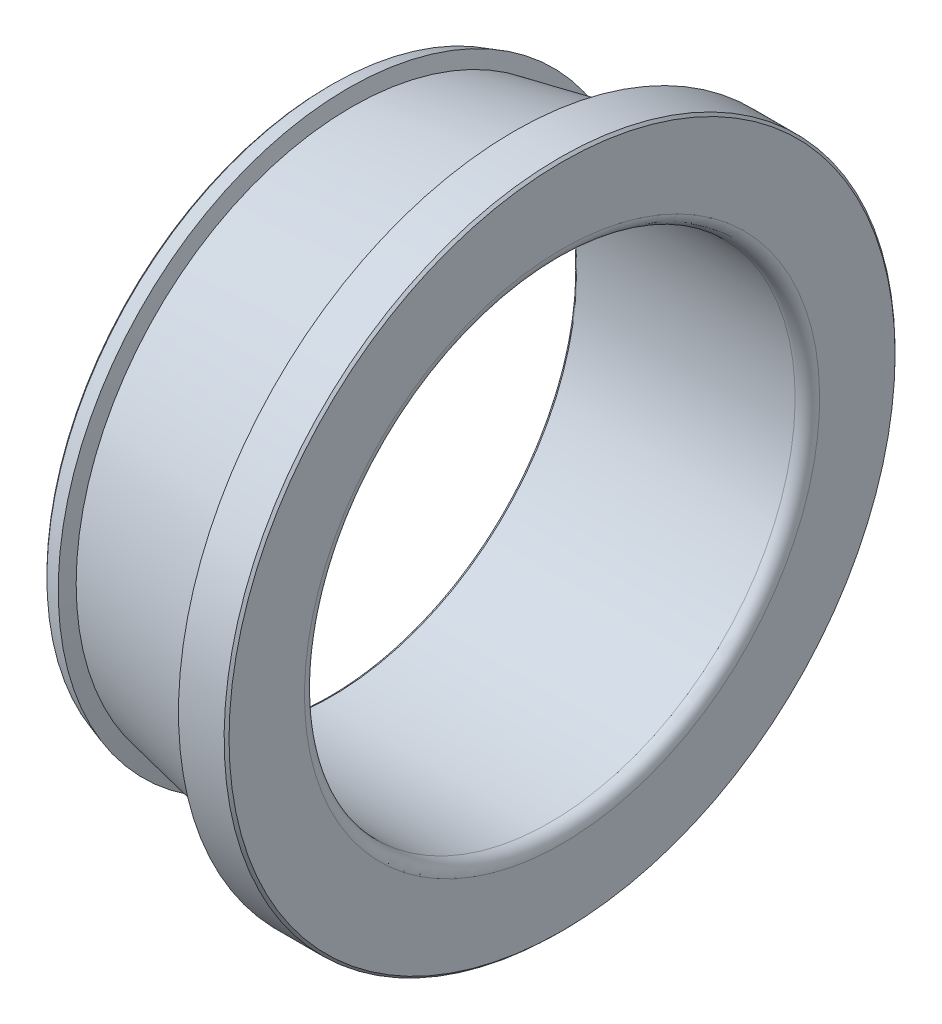
ISO-10303-21;
HEADER;
FILE_DESCRIPTION(('STEP AP214'),'2;1');
FILE_NAME('part.step','',(''),(''),'','','');
FILE_SCHEMA(('AUTOMOTIVE_DESIGN { 1 0 10303 214 1 1 1 1 }'));
ENDSEC;
DATA;
#1=APPLICATION_CONTEXT('core data for automotive mechanical design processes');
#2=APPLICATION_PROTOCOL_DEFINITION('international standard','automotive_design',2000,#1);
#3=PRODUCT_CONTEXT('',#1,'mechanical');
#4=PRODUCT('Part','Part','',(#3));
#5=PRODUCT_RELATED_PRODUCT_CATEGORY('part','',(#4));
#6=PRODUCT_DEFINITION_FORMATION('','',#4);
#7=PRODUCT_DEFINITION_CONTEXT('part definition',#1,'design');
#8=PRODUCT_DEFINITION('design','',#6,#7);
#9=PRODUCT_DEFINITION_SHAPE('','',#8);
#10=(LENGTH_UNIT() NAMED_UNIT(*) SI_UNIT(.MILLI.,.METRE.));
#11=(NAMED_UNIT(*) PLANE_ANGLE_UNIT() SI_UNIT($,.RADIAN.));
#12=(NAMED_UNIT(*) SI_UNIT($,.STERADIAN.) SOLID_ANGLE_UNIT());
#13=UNCERTAINTY_MEASURE_WITH_UNIT(LENGTH_MEASURE(1.E-05),#10,'distance_accuracy_value','');
#14=(GEOMETRIC_REPRESENTATION_CONTEXT(3) GLOBAL_UNCERTAINTY_ASSIGNED_CONTEXT((#13)) GLOBAL_UNIT_ASSIGNED_CONTEXT((#10,
#11,#12)) REPRESENTATION_CONTEXT('',''));
#15=CARTESIAN_POINT('',(0.,0.,0.));
#16=DIRECTION('',(0.,0.,1.));
#17=DIRECTION('',(1.,0.,0.));
#18=AXIS2_PLACEMENT_3D('',#15,#16,#17);
#19=CARTESIAN_POINT('',(6.625,0.,0.));
#20=DIRECTION('',(1.,0.,0.));
#21=DIRECTION('',(0.,1.,0.));
#22=AXIS2_PLACEMENT_3D('',#19,#20,#21);
#23=CONICAL_SURFACE('',#22,25.275,0.312383146898865);
#24=CARTESIAN_POINT('',(0.2,0.,0.));
#25=DIRECTION('',(1.,0.,0.));
#26=DIRECTION('',(0.,1.,0.));
#27=AXIS2_PLACEMENT_3D('',#24,#25,#26);
#28=CIRCLE('',#27,23.2);
#29=CARTESIAN_POINT('',(0.2,23.2,0.));
#30=VERTEX_POINT('',#29);
#31=EDGE_CURVE('E10',#30,#30,#28,.T.);
#32=ORIENTED_EDGE('',*,*,#31,.T.);
#33=EDGE_LOOP('',(#32));
#34=FACE_BOUND('',#33,.T.);
#35=CARTESIAN_POINT('',(1.5630298990273,0.,0.));
#36=DIRECTION('',(-1.,0.,0.));
#37=DIRECTION('',(0.,1.,0.));
#38=AXIS2_PLACEMENT_3D('',#35,#36,#37);
#39=CIRCLE('',#38,23.6402003175847);
#40=CARTESIAN_POINT('',(1.5630298990273,-23.6402003175847,0.));
#41=VERTEX_POINT('',#40);
#42=EDGE_CURVE('E59',#41,#41,#39,.T.);
#43=ORIENTED_EDGE('',*,*,#42,.T.);
#44=EDGE_LOOP('',(#43));
#45=FACE_BOUND('',#44,.T.);
#46=ADVANCED_FACE('F15',(#34,#45),#23,.T.);
#47=CARTESIAN_POINT('',(0.1,0.,0.));
#48=DIRECTION('',(1.,0.,0.));
#49=DIRECTION('',(0.,1.,0.));
#50=AXIS2_PLACEMENT_3D('',#47,#48,#49);
#51=CONICAL_SURFACE('',#50,23.1,0.785398163397446);
#52=CARTESIAN_POINT('',(0.,0.,0.));
#53=DIRECTION('',(1.,0.,0.));
#54=DIRECTION('',(0.,1.,0.));
#55=AXIS2_PLACEMENT_3D('',#52,#53,#54);
#56=CIRCLE('',#55,23.);
#57=CARTESIAN_POINT('',(0.,23.,0.));
#58=VERTEX_POINT('',#57);
#59=EDGE_CURVE('E25',#58,#58,#56,.T.);
#60=ORIENTED_EDGE('',*,*,#59,.T.);
#61=EDGE_LOOP('',(#60));
#62=FACE_BOUND('',#61,.T.);
#63=ORIENTED_EDGE('',*,*,#31,.F.);
#64=EDGE_LOOP('',(#63));
#65=FACE_BOUND('',#64,.T.);
#66=ADVANCED_FACE('F100',(#62,#65),#51,.T.);
#67=CARTESIAN_POINT('',(0.,21.6,0.));
#68=DIRECTION('',(-1.,0.,0.));
#69=DIRECTION('',(0.,-1.,0.));
#70=AXIS2_PLACEMENT_3D('',#67,#68,#69);
#71=PLANE('',#70);
#72=CARTESIAN_POINT('',(0.,0.,0.));
#73=DIRECTION('',(1.,0.,0.));
#74=DIRECTION('',(0.,1.,0.));
#75=AXIS2_PLACEMENT_3D('',#72,#73,#74);
#76=CIRCLE('',#75,20.2);
#77=CARTESIAN_POINT('',(0.,20.2,0.));
#78=VERTEX_POINT('',#77);
#79=EDGE_CURVE('E66',#78,#78,#76,.T.);
#80=ORIENTED_EDGE('',*,*,#79,.T.);
#81=EDGE_LOOP('',(#80));
#82=FACE_BOUND('',#81,.T.);
#83=ORIENTED_EDGE('',*,*,#59,.F.);
#84=EDGE_LOOP('',(#83));
#85=FACE_BOUND('',#84,.T.);
#86=ADVANCED_FACE('F105',(#82,#85),#71,.T.);
#87=CARTESIAN_POINT('',(0.2,0.,0.));
#88=DIRECTION('',(1.,0.,0.));
#89=DIRECTION('',(0.,0.,-1.));
#90=AXIS2_PLACEMENT_3D('',#87,#88,#89);
#91=TOROIDAL_SURFACE('',#90,20.2,0.2);
#92=CARTESIAN_POINT('',(0.2,0.,0.));
#93=DIRECTION('',(1.,0.,0.));
#94=DIRECTION('',(0.,1.,0.));
#95=AXIS2_PLACEMENT_3D('',#92,#93,#94);
#96=CIRCLE('',#95,20.);
#97=CARTESIAN_POINT('',(0.2,20.,0.));
#98=VERTEX_POINT('',#97);
#99=EDGE_CURVE('E65',#98,#98,#96,.T.);
#100=ORIENTED_EDGE('',*,*,#99,.T.);
#101=EDGE_LOOP('',(#100));
#102=FACE_BOUND('',#101,.T.);
#103=ORIENTED_EDGE('',*,*,#79,.F.);
#104=EDGE_LOOP('',(#103));
#105=FACE_BOUND('',#104,.T.);
#106=ADVANCED_FACE('F114',(#102,#105),#91,.T.);
#107=CARTESIAN_POINT('',(9.1,0.,0.));
#108=DIRECTION('',(-1.,0.,0.));
#109=DIRECTION('',(0.,1.,0.));
#110=AXIS2_PLACEMENT_3D('',#107,#108,#109);
#111=CYLINDRICAL_SURFACE('',#110,20.);
#112=CARTESIAN_POINT('',(18.,0.,0.));
#113=DIRECTION('',(1.,0.,0.));
#114=DIRECTION('',(0.,1.,0.));
#115=AXIS2_PLACEMENT_3D('',#112,#113,#114);
#116=CIRCLE('',#115,20.);
#117=CARTESIAN_POINT('',(18.,20.,0.));
#118=VERTEX_POINT('',#117);
#119=EDGE_CURVE('E67',#118,#118,#116,.T.);
#120=ORIENTED_EDGE('',*,*,#119,.T.);
#121=EDGE_LOOP('',(#120));
#122=FACE_BOUND('',#121,.T.);
#123=ORIENTED_EDGE('',*,*,#99,.F.);
#124=EDGE_LOOP('',(#123));
#125=FACE_BOUND('',#124,.T.);
#126=ADVANCED_FACE('F110',(#122,#125),#111,.F.);
#127=CARTESIAN_POINT('',(18.,0.,0.));
#128=DIRECTION('',(1.,0.,0.));
#129=DIRECTION('',(0.,0.,-1.));
#130=AXIS2_PLACEMENT_3D('',#127,#128,#129);
#131=TOROIDAL_SURFACE('',#130,21.,1.);
#132=CARTESIAN_POINT('',(19.,0.,0.));
#133=DIRECTION('',(1.,0.,0.));
#134=DIRECTION('',(0.,1.,0.));
#135=AXIS2_PLACEMENT_3D('',#132,#133,#134);
#136=CIRCLE('',#135,21.);
#137=CARTESIAN_POINT('',(19.,21.,0.));
#138=VERTEX_POINT('',#137);
#139=EDGE_CURVE('E73',#138,#138,#136,.T.);
#140=ORIENTED_EDGE('',*,*,#139,.T.);
#141=EDGE_LOOP('',(#140));
#142=FACE_BOUND('',#141,.T.);
#143=ORIENTED_EDGE('',*,*,#119,.F.);
#144=EDGE_LOOP('',(#143));
#145=FACE_BOUND('',#144,.T.);
#146=ADVANCED_FACE('F95',(#142,#145),#131,.T.);
#147=CARTESIAN_POINT('',(19.,24.075,0.));
#148=DIRECTION('',(1.,0.,0.));
#149=DIRECTION('',(0.,1.,0.));
#150=AXIS2_PLACEMENT_3D('',#147,#148,#149);
#151=PLANE('',#150);
#152=CARTESIAN_POINT('',(19.,0.,0.));
#153=DIRECTION('',(1.,0.,0.));
#154=DIRECTION('',(0.,1.,0.));
#155=AXIS2_PLACEMENT_3D('',#152,#153,#154);
#156=CIRCLE('',#155,27.15);
#157=CARTESIAN_POINT('',(19.,27.15,0.));
#158=VERTEX_POINT('',#157);
#159=EDGE_CURVE('E61',#158,#158,#156,.T.);
#160=ORIENTED_EDGE('',*,*,#159,.T.);
#161=EDGE_LOOP('',(#160));
#162=FACE_BOUND('',#161,.T.);
#163=ORIENTED_EDGE('',*,*,#139,.F.);
#164=EDGE_LOOP('',(#163));
#165=FACE_BOUND('',#164,.T.);
#166=ADVANCED_FACE('F81',(#162,#165),#151,.T.);
#167=CARTESIAN_POINT('',(18.9,0.,0.));
#168=DIRECTION('',(-1.,0.,0.));
#169=DIRECTION('',(0.,1.,0.));
#170=AXIS2_PLACEMENT_3D('',#167,#168,#169);
#171=CONICAL_SURFACE('',#170,27.25,0.785398163397448);
#172=CARTESIAN_POINT('',(18.8,0.,0.));
#173=DIRECTION('',(1.,0.,0.));
#174=DIRECTION('',(0.,1.,0.));
#175=AXIS2_PLACEMENT_3D('',#172,#173,#174);
#176=CIRCLE('',#175,27.35);
#177=CARTESIAN_POINT('',(18.8,27.35,0.));
#178=VERTEX_POINT('',#177);
#179=EDGE_CURVE('E58',#178,#178,#176,.T.);
#180=ORIENTED_EDGE('',*,*,#179,.T.);
#181=EDGE_LOOP('',(#180));
#182=FACE_BOUND('',#181,.T.);
#183=ORIENTED_EDGE('',*,*,#159,.F.);
#184=EDGE_LOOP('',(#183));
#185=FACE_BOUND('',#184,.T.);
#186=ADVANCED_FACE('F84',(#182,#185),#171,.T.);
#187=CARTESIAN_POINT('',(15.925,0.,0.));
#188=DIRECTION('',(-1.,0.,0.));
#189=DIRECTION('',(0.,1.,0.));
#190=AXIS2_PLACEMENT_3D('',#187,#188,#189);
#191=CYLINDRICAL_SURFACE('',#190,27.35);
#192=ORIENTED_EDGE('',*,*,#179,.F.);
#193=EDGE_LOOP('',(#192));
#194=FACE_BOUND('',#193,.T.);
#195=CARTESIAN_POINT('',(15.0775192430243,0.,0.));
#196=DIRECTION('',(1.,0.,0.));
#197=DIRECTION('',(0.,1.,0.));
#198=AXIS2_PLACEMENT_3D('',#195,#196,#197);
#199=CIRCLE('',#198,27.35);
#200=CARTESIAN_POINT('',(15.0775192430243,-27.35,0.));
#201=VERTEX_POINT('',#200);
#202=EDGE_CURVE('E55',#201,#201,#199,.T.);
#203=ORIENTED_EDGE('',*,*,#202,.T.);
#204=EDGE_LOOP('',(#203));
#205=FACE_BOUND('',#204,.T.);
#206=ADVANCED_FACE('F56',(#194,#205),#191,.T.);
#207=CARTESIAN_POINT('',(14.7919694532047,0.,0.));
#208=DIRECTION('',(-1.,0.,0.));
#209=DIRECTION('',(0.,1.,0.));
#210=AXIS2_PLACEMENT_3D('',#207,#208,#209);
#211=CONICAL_SURFACE('',#210,28.6119177932924,1.34826161117786);
#212=CARTESIAN_POINT('',(15.5644283498509,0.,0.));
#213=DIRECTION('',(1.,0.,0.));
#214=DIRECTION('',(0.,1.,0.));
#215=AXIS2_PLACEMENT_3D('',#212,#213,#214);
#216=CIRCLE('',#215,25.1982237160512);
#217=CARTESIAN_POINT('',(15.5644283498509,25.1982237160512,0.));
#218=VERTEX_POINT('',#217);
#219=EDGE_CURVE('E19',#218,#218,#216,.T.);
#220=ORIENTED_EDGE('',*,*,#219,.T.);
#221=EDGE_LOOP('',(#220));
#222=FACE_BOUND('',#221,.T.);
#223=ORIENTED_EDGE('',*,*,#202,.F.);
#224=EDGE_LOOP('',(#223));
#225=FACE_BOUND('',#224,.T.);
#226=ADVANCED_FACE('F93',(#222,#225),#211,.F.);
#227=CARTESIAN_POINT('',(1.13719314423961,0.,0.));
#228=DIRECTION('',(-1.,0.,0.));
#229=DIRECTION('',(0.,1.,0.));
#230=AXIS2_PLACEMENT_3D('',#227,#228,#229);
#231=CONICAL_SURFACE('',#230,25.5220822067076,1.34826161117786);
#232=CARTESIAN_POINT('',(1.83323694699364,0.,0.));
#233=DIRECTION('',(1.,0.,0.));
#234=DIRECTION('',(0.,1.,0.));
#235=AXIS2_PLACEMENT_3D('',#232,#233,#234);
#236=CIRCLE('',#235,22.4460860374899);
#237=CARTESIAN_POINT('',(1.83323694699364,22.4460860374899,0.));
#238=VERTEX_POINT('',#237);
#239=EDGE_CURVE('E133',#238,#238,#236,.T.);
#240=ORIENTED_EDGE('',*,*,#239,.F.);
#241=EDGE_LOOP('',(#240));
#242=FACE_BOUND('',#241,.T.);
#243=ORIENTED_EDGE('',*,*,#42,.F.);
#244=EDGE_LOOP('',(#243));
#245=FACE_BOUND('',#244,.T.);
#246=ADVANCED_FACE('F140',(#242,#245),#231,.T.);
#247=CARTESIAN_POINT('',(8.69883264842227,0.,0.));
#248=DIRECTION('',(1.,0.,0.));
#249=DIRECTION('',(0.,1.,0.));
#250=AXIS2_PLACEMENT_3D('',#247,#248,#249);
#251=CONICAL_SURFACE('',#250,23.8221548767706,0.19780863610403);
#252=ORIENTED_EDGE('',*,*,#219,.F.);
#253=EDGE_LOOP('',(#252));
#254=FACE_BOUND('',#253,.T.);
#255=ORIENTED_EDGE('',*,*,#239,.T.);
#256=EDGE_LOOP('',(#255));
#257=FACE_BOUND('',#256,.T.);
#258=ADVANCED_FACE('F17',(#254,#257),#251,.T.);
#259=CLOSED_SHELL('',(#46,#66,#86,#106,#126,#146,#166,#186,#206,#226,#246,#258));
#260=MANIFOLD_SOLID_BREP('B1',#259);
#261=ADVANCED_BREP_SHAPE_REPRESENTATION('',(#18,#260),#14);
#262=SHAPE_DEFINITION_REPRESENTATION(#9,#261);
ENDSEC;
END-ISO-10303-21;
